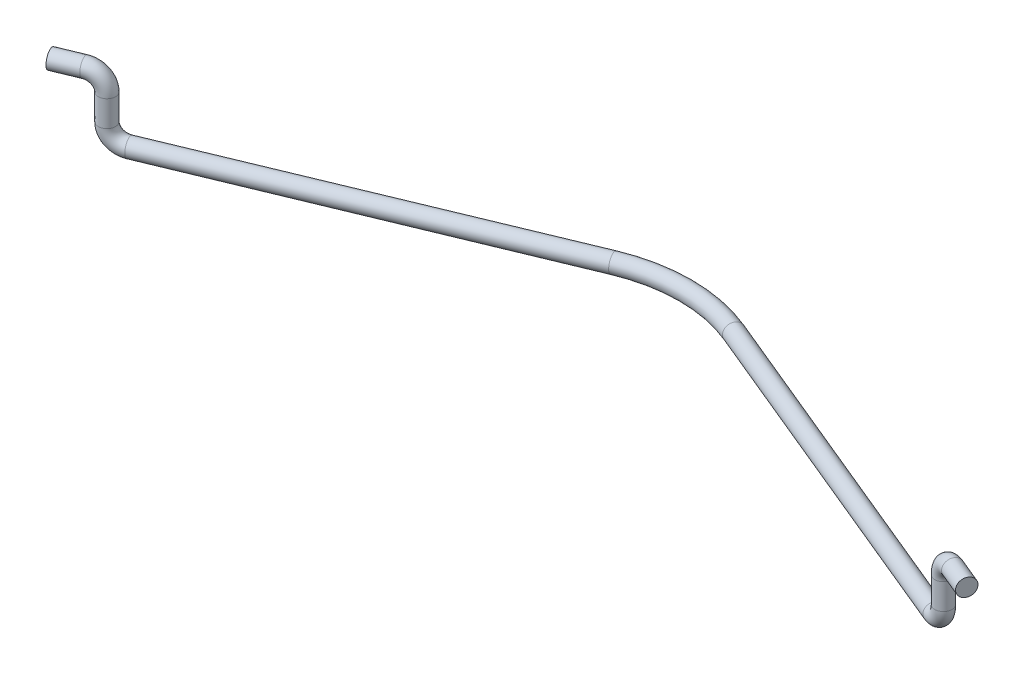
ISO-10303-21;
HEADER;
FILE_DESCRIPTION(('STEP AP214'),'2;1');
FILE_NAME('part.step','',(''),(''),'','','');
FILE_SCHEMA(('AUTOMOTIVE_DESIGN { 1 0 10303 214 1 1 1 1 }'));
ENDSEC;
DATA;
#1=APPLICATION_CONTEXT('core data for automotive mechanical design processes');
#2=APPLICATION_PROTOCOL_DEFINITION('international standard','automotive_design',2000,#1);
#3=PRODUCT_CONTEXT('',#1,'mechanical');
#4=PRODUCT('Part','Part','',(#3));
#5=PRODUCT_RELATED_PRODUCT_CATEGORY('part','',(#4));
#6=PRODUCT_DEFINITION_FORMATION('','',#4);
#7=PRODUCT_DEFINITION_CONTEXT('part definition',#1,'design');
#8=PRODUCT_DEFINITION('design','',#6,#7);
#9=PRODUCT_DEFINITION_SHAPE('','',#8);
#10=(LENGTH_UNIT() NAMED_UNIT(*) SI_UNIT(.MILLI.,.METRE.));
#11=(NAMED_UNIT(*) PLANE_ANGLE_UNIT() SI_UNIT($,.RADIAN.));
#12=(NAMED_UNIT(*) SI_UNIT($,.STERADIAN.) SOLID_ANGLE_UNIT());
#13=UNCERTAINTY_MEASURE_WITH_UNIT(LENGTH_MEASURE(1.E-05),#10,'distance_accuracy_value','');
#14=(GEOMETRIC_REPRESENTATION_CONTEXT(3) GLOBAL_UNCERTAINTY_ASSIGNED_CONTEXT((#13)) GLOBAL_UNIT_ASSIGNED_CONTEXT((#10,
#11,#12)) REPRESENTATION_CONTEXT('',''));
#15=CARTESIAN_POINT('',(0.,0.,0.));
#16=DIRECTION('',(0.,0.,1.));
#17=DIRECTION('',(1.,0.,0.));
#18=AXIS2_PLACEMENT_3D('',#15,#16,#17);
#19=CARTESIAN_POINT('',(0.408513024484285,7.,18.9453565219009));
#20=DIRECTION('',(0.923879532511286,0.,0.382683432365091));
#21=DIRECTION('',(0.,1.,0.));
#22=AXIS2_PLACEMENT_3D('',#19,#20,#21);
#23=CYLINDRICAL_SURFACE('',#22,1.);
#24=CARTESIAN_POINT('',(3.18015162201815,6.99999999999999,20.0934068189962));
#25=DIRECTION('',(0.923879532511286,0.,0.382683432365091));
#26=DIRECTION('',(0.382683432365091,0.,-0.923879532511286));
#27=AXIS2_PLACEMENT_3D('',#24,#25,#26);
#28=CIRCLE('',#27,1.);
#29=CARTESIAN_POINT('',(3.56283505438324,6.99999999999999,19.1695272864849));
#30=VERTEX_POINT('',#29);
#31=EDGE_CURVE('E107',#30,#30,#28,.T.);
#32=ORIENTED_EDGE('',*,*,#31,.F.);
#33=EDGE_LOOP('',(#32));
#34=FACE_BOUND('',#33,.T.);
#35=CARTESIAN_POINT('',(0.408513024484285,7.,18.9453565219009));
#36=DIRECTION('',(0.923879532511286,0.,0.382683432365091));
#37=DIRECTION('',(0.382683432365091,0.,-0.923879532511286));
#38=AXIS2_PLACEMENT_3D('',#35,#36,#37);
#39=CIRCLE('',#38,1.);
#40=CARTESIAN_POINT('',(0.791196456849375,7.,18.0214769893896));
#41=VERTEX_POINT('',#40);
#42=EDGE_CURVE('E102',#41,#41,#39,.T.);
#43=ORIENTED_EDGE('',*,*,#42,.T.);
#44=EDGE_LOOP('',(#43));
#45=FACE_BOUND('',#44,.T.);
#46=ADVANCED_FACE('F78',(#34,#45),#23,.T.);
#47=CARTESIAN_POINT('',(0.408513024484285,4.99999999999999,18.9453565219009));
#48=DIRECTION('',(-0.382683432365091,0.,0.923879532511286));
#49=DIRECTION('',(0.923879532511286,0.,0.382683432365091));
#50=AXIS2_PLACEMENT_3D('',#47,#48,#49);
#51=TOROIDAL_SURFACE('',#50,2.00000000000001,1.);
#52=CARTESIAN_POINT('',(-1.4392460405383,4.99999999999999,18.1799896571707));
#53=DIRECTION('',(0.,1.,0.));
#54=DIRECTION('',(0.382683432365091,0.,-0.923879532511286));
#55=AXIS2_PLACEMENT_3D('',#52,#53,#54);
#56=CIRCLE('',#55,1.);
#57=CARTESIAN_POINT('',(-1.05656260817321,4.99999999999999,17.2561101246594));
#58=VERTEX_POINT('',#57);
#59=EDGE_CURVE('E98',#58,#58,#56,.T.);
#60=ORIENTED_EDGE('',*,*,#59,.T.);
#61=EDGE_LOOP('',(#60));
#62=FACE_BOUND('',#61,.T.);
#63=ORIENTED_EDGE('',*,*,#42,.F.);
#64=EDGE_LOOP('',(#63));
#65=FACE_BOUND('',#64,.T.);
#66=ADVANCED_FACE('F115',(#62,#65),#51,.T.);
#67=CARTESIAN_POINT('',(-1.4392460405383,4.99999999999999,18.1799896571707));
#68=DIRECTION('',(0.,-1.,0.));
#69=DIRECTION('',(0.923879532511286,0.,0.382683432365091));
#70=AXIS2_PLACEMENT_3D('',#67,#68,#69);
#71=CYLINDRICAL_SURFACE('',#70,1.);
#72=CARTESIAN_POINT('',(-1.43924604053828,1.99999999999999,18.1799896571707));
#73=DIRECTION('',(0.,1.,0.));
#74=DIRECTION('',(0.382683432365091,0.,-0.923879532511286));
#75=AXIS2_PLACEMENT_3D('',#72,#73,#74);
#76=CIRCLE('',#75,1.);
#77=CARTESIAN_POINT('',(-1.05656260817319,1.99999999999999,17.2561101246595));
#78=VERTEX_POINT('',#77);
#79=EDGE_CURVE('E12',#78,#78,#76,.T.);
#80=ORIENTED_EDGE('',*,*,#79,.T.);
#81=EDGE_LOOP('',(#80));
#82=FACE_BOUND('',#81,.T.);
#83=ORIENTED_EDGE('',*,*,#59,.F.);
#84=EDGE_LOOP('',(#83));
#85=FACE_BOUND('',#84,.T.);
#86=ADVANCED_FACE('F120',(#82,#85),#71,.T.);
#87=CARTESIAN_POINT('',(-3.28700510556086,1.99999999999999,17.4146227924406));
#88=DIRECTION('',(0.382683432365091,0.,-0.923879532511286));
#89=DIRECTION('',(-0.923879532511286,0.,-0.382683432365091));
#90=AXIS2_PLACEMENT_3D('',#87,#88,#89);
#91=TOROIDAL_SURFACE('',#90,2.00000000000001,1.);
#92=CARTESIAN_POINT('',(-3.28700510556086,0.,17.4146227924406));
#93=DIRECTION('',(0.923879532511286,0.,0.382683432365091));
#94=DIRECTION('',(0.382683432365091,0.,-0.923879532511286));
#95=AXIS2_PLACEMENT_3D('',#92,#93,#94);
#96=CIRCLE('',#95,1.);
#97=CARTESIAN_POINT('',(-2.90432167319577,0.,16.4907432599293));
#98=VERTEX_POINT('',#97);
#99=EDGE_CURVE('E86',#98,#98,#96,.T.);
#100=ORIENTED_EDGE('',*,*,#99,.T.);
#101=EDGE_LOOP('',(#100));
#102=FACE_BOUND('',#101,.T.);
#103=ORIENTED_EDGE('',*,*,#79,.F.);
#104=EDGE_LOOP('',(#103));
#105=FACE_BOUND('',#104,.T.);
#106=ADVANCED_FACE('F126',(#102,#105),#91,.T.);
#107=CARTESIAN_POINT('',(-4.32504164331048,0.,-20.8537204440685));
#108=DIRECTION('',(-0.923879532511287,0.,0.38268343236509));
#109=DIRECTION('',(0.,-1.,0.));
#110=AXIS2_PLACEMENT_3D('',#107,#108,#109);
#111=CYLINDRICAL_SURFACE('',#110,1.);
#112=CARTESIAN_POINT('',(-96.7129948944392,0.,17.4146227924405));
#113=DIRECTION('',(0.923879532511287,0.,-0.38268343236509));
#114=DIRECTION('',(-0.38268343236509,0.,-0.923879532511287));
#115=AXIS2_PLACEMENT_3D('',#112,#113,#114);
#116=CIRCLE('',#115,1.);
#117=CARTESIAN_POINT('',(-97.0956783268043,0.,16.4907432599292));
#118=VERTEX_POINT('',#117);
#119=EDGE_CURVE('E91',#118,#118,#116,.T.);
#120=ORIENTED_EDGE('',*,*,#119,.T.);
#121=EDGE_LOOP('',(#120));
#122=FACE_BOUND('',#121,.T.);
#123=CARTESIAN_POINT('',(-56.9861749964538,0.,0.959235200741638));
#124=DIRECTION('',(0.923879532511287,0.,-0.38268343236509));
#125=DIRECTION('',(0.,1.,0.));
#126=AXIS2_PLACEMENT_3D('',#123,#124,#125);
#127=CIRCLE('',#126,1.);
#128=CARTESIAN_POINT('',(-56.9861749964538,0.999999999999969,0.959235200741638));
#129=VERTEX_POINT('',#128);
#130=EDGE_CURVE('E168',#129,#129,#127,.T.);
#131=ORIENTED_EDGE('',*,*,#130,.F.);
#132=EDGE_LOOP('',(#131));
#133=FACE_BOUND('',#132,.T.);
#134=ADVANCED_FACE('F131',(#122,#133),#111,.T.);
#135=CARTESIAN_POINT('',(-96.7129948944392,1.99999999999999,17.4146227924405));
#136=DIRECTION('',(-0.38268343236509,0.,-0.923879532511287));
#137=DIRECTION('',(-0.923879532511287,0.,0.38268343236509));
#138=AXIS2_PLACEMENT_3D('',#135,#136,#137);
#139=TOROIDAL_SURFACE('',#138,2.00000000000003,1.);
#140=CARTESIAN_POINT('',(-98.5607539594618,1.99999999999999,18.1799896571707));
#141=DIRECTION('',(0.,-1.,0.));
#142=DIRECTION('',(-0.38268343236509,0.,-0.923879532511287));
#143=AXIS2_PLACEMENT_3D('',#140,#141,#142);
#144=CIRCLE('',#143,1.);
#145=CARTESIAN_POINT('',(-98.9434373918269,1.99999999999999,17.2561101246594));
#146=VERTEX_POINT('',#145);
#147=EDGE_CURVE('E187',#146,#146,#144,.T.);
#148=ORIENTED_EDGE('',*,*,#147,.T.);
#149=EDGE_LOOP('',(#148));
#150=FACE_BOUND('',#149,.T.);
#151=ORIENTED_EDGE('',*,*,#119,.F.);
#152=EDGE_LOOP('',(#151));
#153=FACE_BOUND('',#152,.T.);
#154=ADVANCED_FACE('F135',(#150,#153),#139,.T.);
#155=CARTESIAN_POINT('',(-98.5607539594618,1.99999999999999,18.1799896571707));
#156=DIRECTION('',(0.,1.,0.));
#157=DIRECTION('',(-0.923879532511287,0.,0.38268343236509));
#158=AXIS2_PLACEMENT_3D('',#155,#156,#157);
#159=CYLINDRICAL_SURFACE('',#158,1.);
#160=CARTESIAN_POINT('',(-98.5607539594617,4.99999999999999,18.1799896571707));
#161=DIRECTION('',(0.,-1.,0.));
#162=DIRECTION('',(-0.38268343236509,0.,-0.923879532511287));
#163=AXIS2_PLACEMENT_3D('',#160,#161,#162);
#164=CIRCLE('',#163,1.);
#165=CARTESIAN_POINT('',(-98.9434373918268,4.99999999999999,17.2561101246594));
#166=VERTEX_POINT('',#165);
#167=EDGE_CURVE('E101',#166,#166,#164,.T.);
#168=ORIENTED_EDGE('',*,*,#167,.T.);
#169=EDGE_LOOP('',(#168));
#170=FACE_BOUND('',#169,.T.);
#171=ORIENTED_EDGE('',*,*,#147,.F.);
#172=EDGE_LOOP('',(#171));
#173=FACE_BOUND('',#172,.T.);
#174=ADVANCED_FACE('F139',(#170,#173),#159,.T.);
#175=CARTESIAN_POINT('',(-100.408513024484,4.99999999999999,18.9453565219009));
#176=DIRECTION('',(0.38268343236509,0.,0.923879532511287));
#177=DIRECTION('',(0.923879532511287,0.,-0.38268343236509));
#178=AXIS2_PLACEMENT_3D('',#175,#176,#177);
#179=TOROIDAL_SURFACE('',#178,2.00000000000002,1.);
#180=CARTESIAN_POINT('',(-100.408513024484,7.00000000000001,18.9453565219009));
#181=DIRECTION('',(0.923879532511287,0.,-0.38268343236509));
#182=DIRECTION('',(-0.38268343236509,0.,-0.923879532511287));
#183=AXIS2_PLACEMENT_3D('',#180,#181,#182);
#184=CIRCLE('',#183,1.);
#185=CARTESIAN_POINT('',(-100.791196456849,7.00000000000001,18.0214769893896));
#186=VERTEX_POINT('',#185);
#187=EDGE_CURVE('E169',#186,#186,#184,.T.);
#188=ORIENTED_EDGE('',*,*,#187,.T.);
#189=EDGE_LOOP('',(#188));
#190=FACE_BOUND('',#189,.T.);
#191=ORIENTED_EDGE('',*,*,#167,.F.);
#192=EDGE_LOOP('',(#191));
#193=FACE_BOUND('',#192,.T.);
#194=ADVANCED_FACE('F143',(#190,#193),#179,.T.);
#195=CARTESIAN_POINT('',(-100.408513024484,7.00000000000001,18.9453565219009));
#196=DIRECTION('',(-0.923879532511287,0.,0.38268343236509));
#197=DIRECTION('',(0.,-1.,0.));
#198=AXIS2_PLACEMENT_3D('',#195,#196,#197);
#199=CYLINDRICAL_SURFACE('',#198,1.);
#200=CARTESIAN_POINT('',(-103.180151622018,7.,20.0934068189962));
#201=DIRECTION('',(0.923879532511287,0.,-0.38268343236509));
#202=DIRECTION('',(-0.38268343236509,0.,-0.923879532511287));
#203=AXIS2_PLACEMENT_3D('',#200,#201,#202);
#204=CIRCLE('',#203,1.);
#205=CARTESIAN_POINT('',(-103.562835054383,7.,19.1695272864849));
#206=VERTEX_POINT('',#205);
#207=EDGE_CURVE('E167',#206,#206,#204,.T.);
#208=ORIENTED_EDGE('',*,*,#207,.T.);
#209=EDGE_LOOP('',(#208));
#210=FACE_BOUND('',#209,.T.);
#211=ORIENTED_EDGE('',*,*,#187,.F.);
#212=EDGE_LOOP('',(#211));
#213=FACE_BOUND('',#212,.T.);
#214=ADVANCED_FACE('F147',(#210,#213),#199,.T.);
#215=CARTESIAN_POINT('',(-50.,0.,17.8253536262922));
#216=DIRECTION('',(0.,1.,0.));
#217=DIRECTION('',(0.,0.,1.));
#218=AXIS2_PLACEMENT_3D('',#215,#216,#217);
#219=TOROIDAL_SURFACE('',#218,18.2557550330238,1.);
#220=ORIENTED_EDGE('',*,*,#130,.T.);
#221=EDGE_LOOP('',(#220));
#222=FACE_BOUND('',#221,.T.);
#223=CARTESIAN_POINT('',(-43.0138250035462,0.,0.959235200741648));
#224=DIRECTION('',(0.923879532511286,0.,0.382683432365091));
#225=DIRECTION('',(0.,1.,0.));
#226=AXIS2_PLACEMENT_3D('',#223,#224,#225);
#227=CIRCLE('',#226,1.);
#228=CARTESIAN_POINT('',(-43.0138250035462,0.999999999999972,0.959235200741648));
#229=VERTEX_POINT('',#228);
#230=EDGE_CURVE('E172',#229,#229,#227,.T.);
#231=ORIENTED_EDGE('',*,*,#230,.F.);
#232=EDGE_LOOP('',(#231));
#233=FACE_BOUND('',#232,.T.);
#234=ADVANCED_FACE('F151',(#222,#233),#219,.T.);
#235=CARTESIAN_POINT('',(-3.28700510556086,0.,17.4146227924406));
#236=DIRECTION('',(-0.923879532511286,0.,-0.382683432365091));
#237=DIRECTION('',(0.,-1.,0.));
#238=AXIS2_PLACEMENT_3D('',#235,#236,#237);
#239=CYLINDRICAL_SURFACE('',#238,1.);
#240=ORIENTED_EDGE('',*,*,#230,.T.);
#241=EDGE_LOOP('',(#240));
#242=FACE_BOUND('',#241,.T.);
#243=ORIENTED_EDGE('',*,*,#99,.F.);
#244=EDGE_LOOP('',(#243));
#245=FACE_BOUND('',#244,.T.);
#246=ADVANCED_FACE('F155',(#242,#245),#239,.T.);
#247=CARTESIAN_POINT('',(-103.180151622018,7.,20.0934068189962));
#248=DIRECTION('',(0.923879532511287,0.,-0.38268343236509));
#249=DIRECTION('',(-0.38268343236509,0.,-0.923879532511287));
#250=AXIS2_PLACEMENT_3D('',#247,#248,#249);
#251=PLANE('',#250);
#252=ORIENTED_EDGE('',*,*,#207,.F.);
#253=EDGE_LOOP('',(#252));
#254=FACE_BOUND('',#253,.T.);
#255=ADVANCED_FACE('F158',(#254),#251,.F.);
#256=CARTESIAN_POINT('',(3.18015162201815,6.99999999999999,20.0934068189962));
#257=DIRECTION('',(0.923879532511286,0.,0.382683432365091));
#258=DIRECTION('',(0.382683432365091,0.,-0.923879532511286));
#259=AXIS2_PLACEMENT_3D('',#256,#257,#258);
#260=PLANE('',#259);
#261=ORIENTED_EDGE('',*,*,#31,.T.);
#262=EDGE_LOOP('',(#261));
#263=FACE_BOUND('',#262,.T.);
#264=ADVANCED_FACE('F80',(#263),#260,.T.);
#265=CLOSED_SHELL('',(#46,#66,#86,#106,#134,#154,#174,#194,#214,#234,#246,#255,#264));
#266=MANIFOLD_SOLID_BREP('B2',#265);
#267=ADVANCED_BREP_SHAPE_REPRESENTATION('',(#18,#266),#14);
#268=SHAPE_DEFINITION_REPRESENTATION(#9,#267);
ENDSEC;
END-ISO-10303-21;
